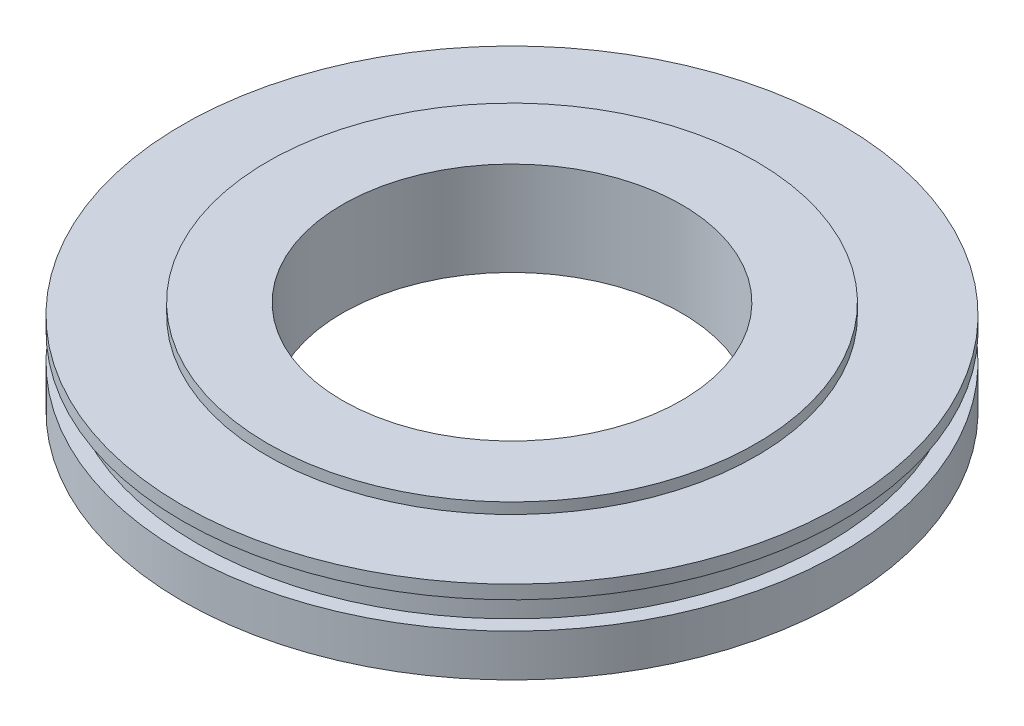
ISO-10303-21;
HEADER;
FILE_DESCRIPTION(('STEP AP214'),'2;1');
FILE_NAME('part.step','',(''),(''),'','','');
FILE_SCHEMA(('AUTOMOTIVE_DESIGN { 1 0 10303 214 1 1 1 1 }'));
ENDSEC;
DATA;
#1=APPLICATION_CONTEXT('core data for automotive mechanical design processes');
#2=APPLICATION_PROTOCOL_DEFINITION('international standard','automotive_design',2000,#1);
#3=PRODUCT_CONTEXT('',#1,'mechanical');
#4=PRODUCT('Part','Part','',(#3));
#5=PRODUCT_RELATED_PRODUCT_CATEGORY('part','',(#4));
#6=PRODUCT_DEFINITION_FORMATION('','',#4);
#7=PRODUCT_DEFINITION_CONTEXT('part definition',#1,'design');
#8=PRODUCT_DEFINITION('design','',#6,#7);
#9=PRODUCT_DEFINITION_SHAPE('','',#8);
#10=(LENGTH_UNIT() NAMED_UNIT(*) SI_UNIT(.MILLI.,.METRE.));
#11=(NAMED_UNIT(*) PLANE_ANGLE_UNIT() SI_UNIT($,.RADIAN.));
#12=(NAMED_UNIT(*) SI_UNIT($,.STERADIAN.) SOLID_ANGLE_UNIT());
#13=UNCERTAINTY_MEASURE_WITH_UNIT(LENGTH_MEASURE(1.E-05),#10,'distance_accuracy_value','');
#14=(GEOMETRIC_REPRESENTATION_CONTEXT(3) GLOBAL_UNCERTAINTY_ASSIGNED_CONTEXT((#13)) GLOBAL_UNIT_ASSIGNED_CONTEXT((#10,
#11,#12)) REPRESENTATION_CONTEXT('',''));
#15=CARTESIAN_POINT('',(0.,0.,0.));
#16=DIRECTION('',(0.,0.,1.));
#17=DIRECTION('',(1.,0.,0.));
#18=AXIS2_PLACEMENT_3D('',#15,#16,#17);
#19=CARTESIAN_POINT('',(0.,2.74793199999976,0.));
#20=DIRECTION('',(0.,-1.,0.));
#21=DIRECTION('',(0.,0.,-1.));
#22=AXIS2_PLACEMENT_3D('',#19,#20,#21);
#23=PLANE('',#22);
#24=CARTESIAN_POINT('',(0.,2.74793199999976,0.));
#25=DIRECTION('',(0.,-1.,0.));
#26=DIRECTION('',(0.,0.,-1.));
#27=AXIS2_PLACEMENT_3D('',#24,#25,#26);
#28=CIRCLE('',#27,30.84068);
#29=CARTESIAN_POINT('',(0.,2.74793199999976,-30.84068));
#30=VERTEX_POINT('',#29);
#31=EDGE_CURVE('E79',#30,#30,#28,.T.);
#32=ORIENTED_EDGE('',*,*,#31,.F.);
#33=EDGE_LOOP('',(#32));
#34=FACE_BOUND('',#33,.T.);
#35=CARTESIAN_POINT('',(0.,2.74793199999976,0.));
#36=DIRECTION('',(0.,-1.,0.));
#37=DIRECTION('',(0.,0.,-1.));
#38=AXIS2_PLACEMENT_3D('',#35,#36,#37);
#39=CIRCLE('',#38,22.86);
#40=CARTESIAN_POINT('',(0.,2.74793199999976,-22.86));
#41=VERTEX_POINT('',#40);
#42=EDGE_CURVE('E10',#41,#41,#39,.F.);
#43=ORIENTED_EDGE('',*,*,#42,.F.);
#44=EDGE_LOOP('',(#43));
#45=FACE_BOUND('',#44,.T.);
#46=ADVANCED_FACE('F43',(#34,#45),#23,.F.);
#47=CARTESIAN_POINT('',(0.,0.,0.));
#48=DIRECTION('',(0.,1.,0.));
#49=DIRECTION('',(0.,0.,1.));
#50=AXIS2_PLACEMENT_3D('',#47,#48,#49);
#51=CYLINDRICAL_SURFACE('',#50,15.875);
#52=CARTESIAN_POINT('',(0.,-5.02081800000016,0.));
#53=DIRECTION('',(0.,1.,0.));
#54=DIRECTION('',(0.,0.,1.));
#55=AXIS2_PLACEMENT_3D('',#52,#53,#54);
#56=CIRCLE('',#55,15.875);
#57=CARTESIAN_POINT('',(0.,-5.02081800000016,15.875));
#58=VERTEX_POINT('',#57);
#59=EDGE_CURVE('E51',#58,#58,#56,.T.);
#60=ORIENTED_EDGE('',*,*,#59,.F.);
#61=EDGE_LOOP('',(#60));
#62=FACE_BOUND('',#61,.T.);
#63=CARTESIAN_POINT('',(0.,3.76393199999976,0.));
#64=DIRECTION('',(0.,1.,0.));
#65=DIRECTION('',(0.,0.,1.));
#66=AXIS2_PLACEMENT_3D('',#63,#64,#65);
#67=CIRCLE('',#66,15.875);
#68=CARTESIAN_POINT('',(0.,3.76393199999976,15.875));
#69=VERTEX_POINT('',#68);
#70=EDGE_CURVE('E87',#69,#69,#67,.T.);
#71=ORIENTED_EDGE('',*,*,#70,.T.);
#72=EDGE_LOOP('',(#71));
#73=FACE_BOUND('',#72,.T.);
#74=ADVANCED_FACE('F45',(#62,#73),#51,.F.);
#75=CARTESIAN_POINT('',(0.,-5.02081800000007,15.875));
#76=DIRECTION('',(0.,-1.,0.));
#77=DIRECTION('',(0.,0.,-1.));
#78=AXIS2_PLACEMENT_3D('',#75,#76,#77);
#79=PLANE('',#78);
#80=ORIENTED_EDGE('',*,*,#59,.T.);
#81=EDGE_LOOP('',(#80));
#82=FACE_BOUND('',#81,.T.);
#83=CARTESIAN_POINT('',(0.,-5.02081799999997,0.));
#84=DIRECTION('',(0.,1.,0.));
#85=DIRECTION('',(0.,0.,1.));
#86=AXIS2_PLACEMENT_3D('',#83,#84,#85);
#87=CIRCLE('',#86,30.84068);
#88=CARTESIAN_POINT('',(0.,-5.02081799999997,30.84068));
#89=VERTEX_POINT('',#88);
#90=EDGE_CURVE('E56',#89,#89,#87,.T.);
#91=ORIENTED_EDGE('',*,*,#90,.F.);
#92=EDGE_LOOP('',(#91));
#93=FACE_BOUND('',#92,.T.);
#94=ADVANCED_FACE('F114',(#82,#93),#79,.T.);
#95=CARTESIAN_POINT('',(0.,0.,0.));
#96=DIRECTION('',(0.,1.,0.));
#97=DIRECTION('',(0.,0.,1.));
#98=AXIS2_PLACEMENT_3D('',#95,#96,#97);
#99=CYLINDRICAL_SURFACE('',#98,30.84068);
#100=ORIENTED_EDGE('',*,*,#90,.T.);
#101=EDGE_LOOP('',(#100));
#102=FACE_BOUND('',#101,.T.);
#103=CARTESIAN_POINT('',(0.,-1.06206800000024,0.));
#104=DIRECTION('',(0.,1.,0.));
#105=DIRECTION('',(0.,0.,1.));
#106=AXIS2_PLACEMENT_3D('',#103,#104,#105);
#107=CIRCLE('',#106,30.84068);
#108=CARTESIAN_POINT('',(0.,-1.06206800000024,30.84068));
#109=VERTEX_POINT('',#108);
#110=EDGE_CURVE('E61',#109,#109,#107,.T.);
#111=ORIENTED_EDGE('',*,*,#110,.F.);
#112=EDGE_LOOP('',(#111));
#113=FACE_BOUND('',#112,.T.);
#114=ADVANCED_FACE('F129',(#102,#113),#99,.T.);
#115=CARTESIAN_POINT('',(0.,-1.06206800000024,30.84068));
#116=DIRECTION('',(0.,1.,0.));
#117=DIRECTION('',(0.,0.,1.));
#118=AXIS2_PLACEMENT_3D('',#115,#116,#117);
#119=PLANE('',#118);
#120=ORIENTED_EDGE('',*,*,#110,.T.);
#121=EDGE_LOOP('',(#120));
#122=FACE_BOUND('',#121,.T.);
#123=CARTESIAN_POINT('',(0.,-1.06206800000024,0.));
#124=DIRECTION('',(0.,1.,0.));
#125=DIRECTION('',(0.,0.,1.));
#126=AXIS2_PLACEMENT_3D('',#123,#124,#125);
#127=CIRCLE('',#126,29.43479);
#128=CARTESIAN_POINT('',(0.,-1.06206800000024,29.43479));
#129=VERTEX_POINT('',#128);
#130=EDGE_CURVE('E67',#129,#129,#127,.T.);
#131=ORIENTED_EDGE('',*,*,#130,.F.);
#132=EDGE_LOOP('',(#131));
#133=FACE_BOUND('',#132,.T.);
#134=ADVANCED_FACE('F125',(#122,#133),#119,.T.);
#135=CARTESIAN_POINT('',(0.,0.,0.));
#136=DIRECTION('',(0.,1.,0.));
#137=DIRECTION('',(0.,0.,1.));
#138=AXIS2_PLACEMENT_3D('',#135,#136,#137);
#139=CYLINDRICAL_SURFACE('',#138,29.43479);
#140=ORIENTED_EDGE('',*,*,#130,.T.);
#141=EDGE_LOOP('',(#140));
#142=FACE_BOUND('',#141,.T.);
#143=CARTESIAN_POINT('',(0.,1.47793199999976,0.));
#144=DIRECTION('',(0.,1.,0.));
#145=DIRECTION('',(0.,0.,1.));
#146=AXIS2_PLACEMENT_3D('',#143,#144,#145);
#147=CIRCLE('',#146,29.43479);
#148=CARTESIAN_POINT('',(0.,1.47793199999976,29.43479));
#149=VERTEX_POINT('',#148);
#150=EDGE_CURVE('E71',#149,#149,#147,.T.);
#151=ORIENTED_EDGE('',*,*,#150,.F.);
#152=EDGE_LOOP('',(#151));
#153=FACE_BOUND('',#152,.T.);
#154=ADVANCED_FACE('F121',(#142,#153),#139,.T.);
#155=CARTESIAN_POINT('',(0.,1.47793199999976,29.43479));
#156=DIRECTION('',(0.,-1.,0.));
#157=DIRECTION('',(0.,0.,-1.));
#158=AXIS2_PLACEMENT_3D('',#155,#156,#157);
#159=PLANE('',#158);
#160=ORIENTED_EDGE('',*,*,#150,.T.);
#161=EDGE_LOOP('',(#160));
#162=FACE_BOUND('',#161,.T.);
#163=CARTESIAN_POINT('',(0.,1.47793199999976,0.));
#164=DIRECTION('',(0.,1.,0.));
#165=DIRECTION('',(0.,0.,1.));
#166=AXIS2_PLACEMENT_3D('',#163,#164,#165);
#167=CIRCLE('',#166,30.84068);
#168=CARTESIAN_POINT('',(0.,1.47793199999976,30.84068));
#169=VERTEX_POINT('',#168);
#170=EDGE_CURVE('E75',#169,#169,#167,.T.);
#171=ORIENTED_EDGE('',*,*,#170,.F.);
#172=EDGE_LOOP('',(#171));
#173=FACE_BOUND('',#172,.T.);
#174=ADVANCED_FACE('F106',(#162,#173),#159,.T.);
#175=CARTESIAN_POINT('',(0.,0.,0.));
#176=DIRECTION('',(0.,1.,0.));
#177=DIRECTION('',(0.,0.,1.));
#178=AXIS2_PLACEMENT_3D('',#175,#176,#177);
#179=CYLINDRICAL_SURFACE('',#178,30.84068);
#180=ORIENTED_EDGE('',*,*,#170,.T.);
#181=EDGE_LOOP('',(#180));
#182=FACE_BOUND('',#181,.T.);
#183=ORIENTED_EDGE('',*,*,#31,.T.);
#184=EDGE_LOOP('',(#183));
#185=FACE_BOUND('',#184,.T.);
#186=ADVANCED_FACE('F96',(#182,#185),#179,.T.);
#187=CARTESIAN_POINT('',(0.,3.76393199999976,0.));
#188=DIRECTION('',(0.,1.,0.));
#189=DIRECTION('',(0.,0.,1.));
#190=AXIS2_PLACEMENT_3D('',#187,#188,#189);
#191=PLANE('',#190);
#192=CARTESIAN_POINT('',(0.,3.76393199999976,0.));
#193=DIRECTION('',(0.,1.,0.));
#194=DIRECTION('',(0.,0.,1.));
#195=AXIS2_PLACEMENT_3D('',#192,#193,#194);
#196=CIRCLE('',#195,22.86);
#197=CARTESIAN_POINT('',(0.,3.76393199999976,22.86));
#198=VERTEX_POINT('',#197);
#199=EDGE_CURVE('E83',#198,#198,#196,.T.);
#200=ORIENTED_EDGE('',*,*,#199,.T.);
#201=EDGE_LOOP('',(#200));
#202=FACE_BOUND('',#201,.T.);
#203=ORIENTED_EDGE('',*,*,#70,.F.);
#204=EDGE_LOOP('',(#203));
#205=FACE_BOUND('',#204,.T.);
#206=ADVANCED_FACE('F93',(#202,#205),#191,.T.);
#207=CARTESIAN_POINT('',(0.,3.76393199999976,0.));
#208=DIRECTION('',(0.,-1.,0.));
#209=DIRECTION('',(0.,0.,-1.));
#210=AXIS2_PLACEMENT_3D('',#207,#208,#209);
#211=CYLINDRICAL_SURFACE('',#210,22.86);
#212=ORIENTED_EDGE('',*,*,#199,.F.);
#213=EDGE_LOOP('',(#212));
#214=FACE_BOUND('',#213,.T.);
#215=ORIENTED_EDGE('',*,*,#42,.T.);
#216=EDGE_LOOP('',(#215));
#217=FACE_BOUND('',#216,.T.);
#218=ADVANCED_FACE('F95',(#214,#217),#211,.T.);
#219=CLOSED_SHELL('',(#46,#74,#94,#114,#134,#154,#174,#186,#206,#218));
#220=MANIFOLD_SOLID_BREP('B2',#219);
#221=ADVANCED_BREP_SHAPE_REPRESENTATION('',(#18,#220),#14);
#222=SHAPE_DEFINITION_REPRESENTATION(#9,#221);
ENDSEC;
END-ISO-10303-21;
